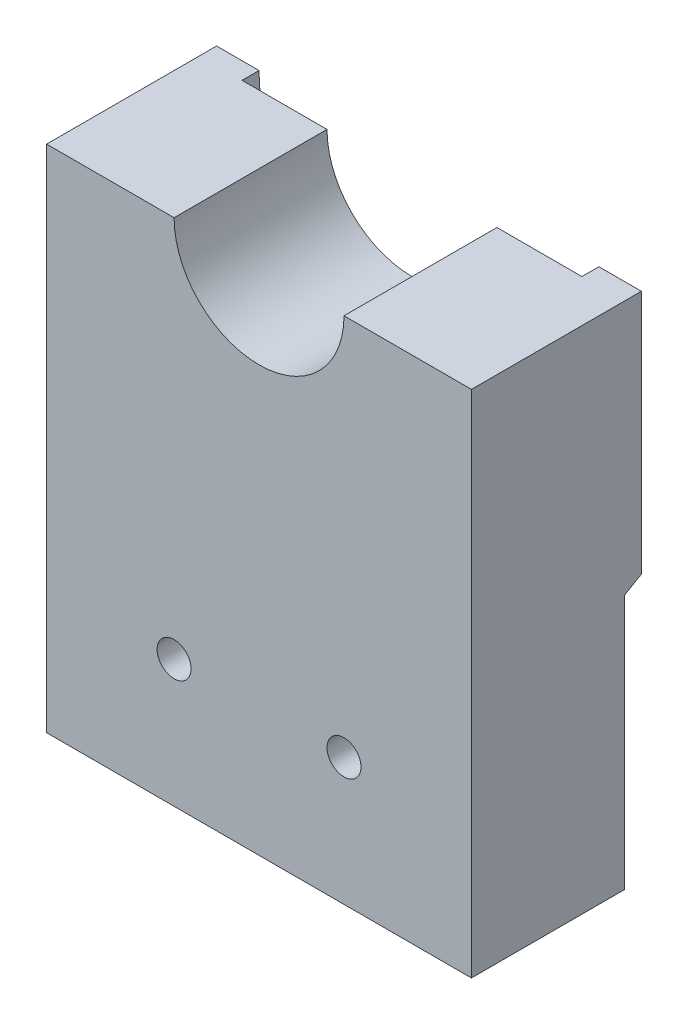
ISO-10303-21;
HEADER;
FILE_DESCRIPTION(('STEP AP214'),'2;1');
FILE_NAME('part.step','',(''),(''),'','','');
FILE_SCHEMA(('AUTOMOTIVE_DESIGN { 1 0 10303 214 1 1 1 1 }'));
ENDSEC;
DATA;
#1=APPLICATION_CONTEXT('core data for automotive mechanical design processes');
#2=APPLICATION_PROTOCOL_DEFINITION('international standard','automotive_design',2000,#1);
#3=PRODUCT_CONTEXT('',#1,'mechanical');
#4=PRODUCT('Part','Part','',(#3));
#5=PRODUCT_RELATED_PRODUCT_CATEGORY('part','',(#4));
#6=PRODUCT_DEFINITION_FORMATION('','',#4);
#7=PRODUCT_DEFINITION_CONTEXT('part definition',#1,'design');
#8=PRODUCT_DEFINITION('design','',#6,#7);
#9=PRODUCT_DEFINITION_SHAPE('','',#8);
#10=(LENGTH_UNIT() NAMED_UNIT(*) SI_UNIT(.MILLI.,.METRE.));
#11=(NAMED_UNIT(*) PLANE_ANGLE_UNIT() SI_UNIT($,.RADIAN.));
#12=(NAMED_UNIT(*) SI_UNIT($,.STERADIAN.) SOLID_ANGLE_UNIT());
#13=UNCERTAINTY_MEASURE_WITH_UNIT(LENGTH_MEASURE(1.E-05),#10,'distance_accuracy_value','');
#14=(GEOMETRIC_REPRESENTATION_CONTEXT(3) GLOBAL_UNCERTAINTY_ASSIGNED_CONTEXT((#13)) GLOBAL_UNIT_ASSIGNED_CONTEXT((#10,
#11,#12)) REPRESENTATION_CONTEXT('',''));
#15=CARTESIAN_POINT('',(0.,0.,0.));
#16=DIRECTION('',(0.,0.,1.));
#17=DIRECTION('',(1.,0.,0.));
#18=AXIS2_PLACEMENT_3D('',#15,#16,#17);
#19=CARTESIAN_POINT('',(0.,30.,10.));
#20=DIRECTION('',(0.,-1.,0.));
#21=DIRECTION('',(0.,0.,-1.));
#22=AXIS2_PLACEMENT_3D('',#19,#20,#21);
#23=PLANE('',#22);
#24=DIRECTION('',(-1.,0.,0.));
#25=VECTOR('',#24,1.);
#26=CARTESIAN_POINT('',(0.,30.,10.));
#27=LINE('',#26,#25);
#28=CARTESIAN_POINT('',(7.5,30.,10.));
#29=VERTEX_POINT('',#28);
#30=CARTESIAN_POINT('',(0.,30.,10.));
#31=VERTEX_POINT('',#30);
#32=EDGE_CURVE('E126',#29,#31,#27,.T.);
#33=ORIENTED_EDGE('',*,*,#32,.F.);
#34=DIRECTION('',(0.,0.,-1.));
#35=VECTOR('',#34,1.);
#36=CARTESIAN_POINT('',(7.5,30.,10.));
#37=LINE('',#36,#35);
#38=CARTESIAN_POINT('',(7.5,30.,1.00000000000001));
#39=VERTEX_POINT('',#38);
#40=EDGE_CURVE('E112',#29,#39,#37,.T.);
#41=ORIENTED_EDGE('',*,*,#40,.T.);
#42=DIRECTION('',(1.,0.,0.));
#43=VECTOR('',#42,1.);
#44=CARTESIAN_POINT('',(22.5,30.,1.00000000000001));
#45=LINE('',#44,#43);
#46=CARTESIAN_POINT('',(2.5,30.,1.00000000000001));
#47=VERTEX_POINT('',#46);
#48=EDGE_CURVE('E195',#47,#39,#45,.T.);
#49=ORIENTED_EDGE('',*,*,#48,.F.);
#50=DIRECTION('',(0.,0.,-1.));
#51=VECTOR('',#50,1.);
#52=CARTESIAN_POINT('',(2.5,30.,23.3606797749979));
#53=LINE('',#52,#51);
#54=CARTESIAN_POINT('',(2.5,30.,0.));
#55=VERTEX_POINT('',#54);
#56=EDGE_CURVE('E187',#47,#55,#53,.T.);
#57=ORIENTED_EDGE('',*,*,#56,.T.);
#58=DIRECTION('',(-1.,0.,0.));
#59=VECTOR('',#58,1.);
#60=CARTESIAN_POINT('',(0.,30.,0.));
#61=LINE('',#60,#59);
#62=CARTESIAN_POINT('',(0.,30.,0.));
#63=VERTEX_POINT('',#62);
#64=EDGE_CURVE('E146',#55,#63,#61,.T.);
#65=ORIENTED_EDGE('',*,*,#64,.T.);
#66=DIRECTION('',(0.,0.,-1.));
#67=VECTOR('',#66,1.);
#68=CARTESIAN_POINT('',(0.,30.,10.));
#69=LINE('',#68,#67);
#70=EDGE_CURVE('E132',#31,#63,#69,.T.);
#71=ORIENTED_EDGE('',*,*,#70,.F.);
#72=EDGE_LOOP('',(#33,#41,#49,#57,#65,#71));
#73=FACE_BOUND('',#72,.T.);
#74=ADVANCED_FACE('F36',(#73),#23,.F.);
#75=CARTESIAN_POINT('',(0.,0.,10.));
#76=DIRECTION('',(1.,0.,0.));
#77=DIRECTION('',(0.,0.,-1.));
#78=AXIS2_PLACEMENT_3D('',#75,#76,#77);
#79=PLANE('',#78);
#80=DIRECTION('',(0.,-0.499999999999998,0.86602540378444));
#81=VECTOR('',#80,1.);
#82=CARTESIAN_POINT('',(0.,15.5773502691896,0.));
#83=LINE('',#82,#81);
#84=CARTESIAN_POINT('',(0.,15.5773502691896,0.));
#85=VERTEX_POINT('',#84);
#86=CARTESIAN_POINT('',(0.,15.,1.));
#87=VERTEX_POINT('',#86);
#88=EDGE_CURVE('E181',#85,#87,#83,.T.);
#89=ORIENTED_EDGE('',*,*,#88,.T.);
#90=DIRECTION('',(0.,-1.,0.));
#91=VECTOR('',#90,1.);
#92=CARTESIAN_POINT('',(0.,15.,1.));
#93=LINE('',#92,#91);
#94=CARTESIAN_POINT('',(0.,0.,1.));
#95=VERTEX_POINT('',#94);
#96=EDGE_CURVE('E178',#87,#95,#93,.T.);
#97=ORIENTED_EDGE('',*,*,#96,.T.);
#98=DIRECTION('',(0.,0.,-1.));
#99=VECTOR('',#98,1.);
#100=CARTESIAN_POINT('',(0.,0.,10.));
#101=LINE('',#100,#99);
#102=CARTESIAN_POINT('',(0.,0.,10.));
#103=VERTEX_POINT('',#102);
#104=EDGE_CURVE('E11',#103,#95,#101,.T.);
#105=ORIENTED_EDGE('',*,*,#104,.F.);
#106=DIRECTION('',(0.,-1.,0.));
#107=VECTOR('',#106,1.);
#108=CARTESIAN_POINT('',(0.,0.,10.));
#109=LINE('',#108,#107);
#110=EDGE_CURVE('E150',#31,#103,#109,.T.);
#111=ORIENTED_EDGE('',*,*,#110,.F.);
#112=ORIENTED_EDGE('',*,*,#70,.T.);
#113=DIRECTION('',(0.,-1.,0.));
#114=VECTOR('',#113,1.);
#115=CARTESIAN_POINT('',(0.,0.,0.));
#116=LINE('',#115,#114);
#117=EDGE_CURVE('E140',#63,#85,#116,.T.);
#118=ORIENTED_EDGE('',*,*,#117,.T.);
#119=EDGE_LOOP('',(#89,#97,#105,#111,#112,#118));
#120=FACE_BOUND('',#119,.T.);
#121=ADVANCED_FACE('F38',(#120),#79,.F.);
#122=CARTESIAN_POINT('',(0.,0.,10.));
#123=DIRECTION('',(0.,1.,0.));
#124=DIRECTION('',(0.,0.,1.));
#125=AXIS2_PLACEMENT_3D('',#122,#123,#124);
#126=PLANE('',#125);
#127=ORIENTED_EDGE('',*,*,#104,.T.);
#128=DIRECTION('',(1.,0.,0.));
#129=VECTOR('',#128,1.);
#130=CARTESIAN_POINT('',(0.,0.,1.));
#131=LINE('',#130,#129);
#132=CARTESIAN_POINT('',(25.,0.,1.));
#133=VERTEX_POINT('',#132);
#134=EDGE_CURVE('E144',#95,#133,#131,.T.);
#135=ORIENTED_EDGE('',*,*,#134,.T.);
#136=DIRECTION('',(0.,0.,-1.));
#137=VECTOR('',#136,1.);
#138=CARTESIAN_POINT('',(25.,0.,10.));
#139=LINE('',#138,#137);
#140=CARTESIAN_POINT('',(25.,0.,10.));
#141=VERTEX_POINT('',#140);
#142=EDGE_CURVE('E44',#141,#133,#139,.T.);
#143=ORIENTED_EDGE('',*,*,#142,.F.);
#144=DIRECTION('',(1.,0.,0.));
#145=VECTOR('',#144,1.);
#146=CARTESIAN_POINT('',(0.,0.,10.));
#147=LINE('',#146,#145);
#148=EDGE_CURVE('E136',#103,#141,#147,.T.);
#149=ORIENTED_EDGE('',*,*,#148,.F.);
#150=EDGE_LOOP('',(#127,#135,#143,#149));
#151=FACE_BOUND('',#150,.T.);
#152=ADVANCED_FACE('F165',(#151),#126,.F.);
#153=CARTESIAN_POINT('',(25.,0.,10.));
#154=DIRECTION('',(-1.,0.,0.));
#155=DIRECTION('',(0.,0.,1.));
#156=AXIS2_PLACEMENT_3D('',#153,#154,#155);
#157=PLANE('',#156);
#158=ORIENTED_EDGE('',*,*,#142,.T.);
#159=DIRECTION('',(0.,-1.,0.));
#160=VECTOR('',#159,1.);
#161=CARTESIAN_POINT('',(25.,15.,1.));
#162=LINE('',#161,#160);
#163=CARTESIAN_POINT('',(25.,15.,1.));
#164=VERTEX_POINT('',#163);
#165=EDGE_CURVE('E161',#164,#133,#162,.T.);
#166=ORIENTED_EDGE('',*,*,#165,.F.);
#167=DIRECTION('',(0.,-0.499999999999998,0.86602540378444));
#168=VECTOR('',#167,1.);
#169=CARTESIAN_POINT('',(25.,15.5773502691896,0.));
#170=LINE('',#169,#168);
#171=CARTESIAN_POINT('',(25.,15.5773502691896,0.));
#172=VERTEX_POINT('',#171);
#173=EDGE_CURVE('E185',#172,#164,#170,.T.);
#174=ORIENTED_EDGE('',*,*,#173,.F.);
#175=DIRECTION('',(0.,1.,0.));
#176=VECTOR('',#175,1.);
#177=CARTESIAN_POINT('',(25.,0.,0.));
#178=LINE('',#177,#176);
#179=CARTESIAN_POINT('',(25.,30.,0.));
#180=VERTEX_POINT('',#179);
#181=EDGE_CURVE('E143',#172,#180,#178,.T.);
#182=ORIENTED_EDGE('',*,*,#181,.T.);
#183=DIRECTION('',(0.,0.,-1.));
#184=VECTOR('',#183,1.);
#185=CARTESIAN_POINT('',(25.,30.,10.));
#186=LINE('',#185,#184);
#187=CARTESIAN_POINT('',(25.,30.,10.));
#188=VERTEX_POINT('',#187);
#189=EDGE_CURVE('E152',#188,#180,#186,.T.);
#190=ORIENTED_EDGE('',*,*,#189,.F.);
#191=DIRECTION('',(0.,1.,0.));
#192=VECTOR('',#191,1.);
#193=CARTESIAN_POINT('',(25.,0.,10.));
#194=LINE('',#193,#192);
#195=EDGE_CURVE('E134',#141,#188,#194,.T.);
#196=ORIENTED_EDGE('',*,*,#195,.F.);
#197=EDGE_LOOP('',(#158,#166,#174,#182,#190,#196));
#198=FACE_BOUND('',#197,.T.);
#199=ADVANCED_FACE('F159',(#198),#157,.F.);
#200=CARTESIAN_POINT('',(17.5,30.,1.00000000000001));
#201=VERTEX_POINT('',#200);
#202=CARTESIAN_POINT('',(22.5,30.,1.00000000000001));
#203=VERTEX_POINT('',#202);
#204=EDGE_CURVE('E198',#201,#203,#45,.T.);
#205=ORIENTED_EDGE('',*,*,#204,.F.);
#206=DIRECTION('',(0.,0.,-1.));
#207=VECTOR('',#206,1.);
#208=CARTESIAN_POINT('',(17.5,30.,10.));
#209=LINE('',#208,#207);
#210=CARTESIAN_POINT('',(17.5,30.,10.));
#211=VERTEX_POINT('',#210);
#212=EDGE_CURVE('E51',#211,#201,#209,.T.);
#213=ORIENTED_EDGE('',*,*,#212,.F.);
#214=EDGE_CURVE('E129',#188,#211,#27,.T.);
#215=ORIENTED_EDGE('',*,*,#214,.F.);
#216=ORIENTED_EDGE('',*,*,#189,.T.);
#217=CARTESIAN_POINT('',(22.5,30.,0.));
#218=VERTEX_POINT('',#217);
#219=EDGE_CURVE('E147',#180,#218,#61,.T.);
#220=ORIENTED_EDGE('',*,*,#219,.T.);
#221=DIRECTION('',(0.,0.,-1.));
#222=VECTOR('',#221,1.);
#223=CARTESIAN_POINT('',(22.5,30.,23.3606797749979));
#224=LINE('',#223,#222);
#225=EDGE_CURVE('E59',#203,#218,#224,.T.);
#226=ORIENTED_EDGE('',*,*,#225,.F.);
#227=EDGE_LOOP('',(#205,#213,#215,#216,#220,#226));
#228=FACE_BOUND('',#227,.T.);
#229=ADVANCED_FACE('F239',(#228),#23,.F.);
#230=CARTESIAN_POINT('',(0.,0.,10.));
#231=DIRECTION('',(0.,0.,-1.));
#232=DIRECTION('',(-1.,0.,0.));
#233=AXIS2_PLACEMENT_3D('',#230,#231,#232);
#234=PLANE('',#233);
#235=CARTESIAN_POINT('',(17.5,7.5,10.));
#236=DIRECTION('',(0.,0.,-1.));
#237=DIRECTION('',(0.,1.,0.));
#238=AXIS2_PLACEMENT_3D('',#235,#236,#237);
#239=CIRCLE('',#238,1.);
#240=CARTESIAN_POINT('',(17.5,8.5,10.));
#241=VERTEX_POINT('',#240);
#242=EDGE_CURVE('E202',#241,#241,#239,.T.);
#243=ORIENTED_EDGE('',*,*,#242,.T.);
#244=EDGE_LOOP('',(#243));
#245=FACE_BOUND('',#244,.T.);
#246=CARTESIAN_POINT('',(7.5,7.5,10.));
#247=DIRECTION('',(0.,0.,-1.));
#248=DIRECTION('',(0.,-1.,0.));
#249=AXIS2_PLACEMENT_3D('',#246,#247,#248);
#250=CIRCLE('',#249,1.);
#251=CARTESIAN_POINT('',(7.5,6.5,10.));
#252=VERTEX_POINT('',#251);
#253=EDGE_CURVE('E207',#252,#252,#250,.T.);
#254=ORIENTED_EDGE('',*,*,#253,.T.);
#255=EDGE_LOOP('',(#254));
#256=FACE_BOUND('',#255,.T.);
#257=ORIENTED_EDGE('',*,*,#214,.T.);
#258=CARTESIAN_POINT('',(12.5,30.,10.));
#259=DIRECTION('',(0.,0.,-1.));
#260=DIRECTION('',(0.,1.,0.));
#261=AXIS2_PLACEMENT_3D('',#258,#259,#260);
#262=CIRCLE('',#261,5.);
#263=EDGE_CURVE('E115',#211,#29,#262,.T.);
#264=ORIENTED_EDGE('',*,*,#263,.T.);
#265=ORIENTED_EDGE('',*,*,#32,.T.);
#266=ORIENTED_EDGE('',*,*,#110,.T.);
#267=ORIENTED_EDGE('',*,*,#148,.T.);
#268=ORIENTED_EDGE('',*,*,#195,.T.);
#269=EDGE_LOOP('',(#257,#264,#265,#266,#267,#268));
#270=FACE_BOUND('',#269,.T.);
#271=ADVANCED_FACE('F124',(#245,#256,#270),#234,.F.);
#272=CARTESIAN_POINT('',(0.,0.,0.));
#273=DIRECTION('',(0.,0.,-1.));
#274=DIRECTION('',(-1.,0.,0.));
#275=AXIS2_PLACEMENT_3D('',#272,#273,#274);
#276=PLANE('',#275);
#277=CARTESIAN_POINT('',(12.5,30.,0.));
#278=DIRECTION('',(0.,0.,-1.));
#279=DIRECTION('',(-1.,0.,0.));
#280=AXIS2_PLACEMENT_3D('',#277,#278,#279);
#281=CIRCLE('',#280,10.);
#282=EDGE_CURVE('E199',#218,#55,#281,.T.);
#283=ORIENTED_EDGE('',*,*,#282,.F.);
#284=ORIENTED_EDGE('',*,*,#219,.F.);
#285=ORIENTED_EDGE('',*,*,#181,.F.);
#286=DIRECTION('',(1.,0.,0.));
#287=VECTOR('',#286,1.);
#288=CARTESIAN_POINT('',(0.,15.5773502691896,0.));
#289=LINE('',#288,#287);
#290=EDGE_CURVE('E172',#85,#172,#289,.T.);
#291=ORIENTED_EDGE('',*,*,#290,.F.);
#292=ORIENTED_EDGE('',*,*,#117,.F.);
#293=ORIENTED_EDGE('',*,*,#64,.F.);
#294=EDGE_LOOP('',(#283,#284,#285,#291,#292,#293));
#295=FACE_BOUND('',#294,.T.);
#296=ADVANCED_FACE('F229',(#295),#276,.T.);
#297=CARTESIAN_POINT('',(0.,15.,1.));
#298=DIRECTION('',(0.,0.,1.));
#299=DIRECTION('',(0.,-1.,0.));
#300=AXIS2_PLACEMENT_3D('',#297,#298,#299);
#301=PLANE('',#300);
#302=CARTESIAN_POINT('',(17.5,7.5,1.));
#303=DIRECTION('',(0.,0.,-1.));
#304=DIRECTION('',(0.,1.,0.));
#305=AXIS2_PLACEMENT_3D('',#302,#303,#304);
#306=CIRCLE('',#305,1.);
#307=CARTESIAN_POINT('',(17.5,8.5,1.));
#308=VERTEX_POINT('',#307);
#309=EDGE_CURVE('E210',#308,#308,#306,.T.);
#310=ORIENTED_EDGE('',*,*,#309,.F.);
#311=EDGE_LOOP('',(#310));
#312=FACE_BOUND('',#311,.T.);
#313=CARTESIAN_POINT('',(7.5,7.5,1.));
#314=DIRECTION('',(0.,0.,-1.));
#315=DIRECTION('',(0.,-1.,0.));
#316=AXIS2_PLACEMENT_3D('',#313,#314,#315);
#317=CIRCLE('',#316,1.);
#318=CARTESIAN_POINT('',(7.5,6.5,1.));
#319=VERTEX_POINT('',#318);
#320=EDGE_CURVE('E204',#319,#319,#317,.T.);
#321=ORIENTED_EDGE('',*,*,#320,.F.);
#322=EDGE_LOOP('',(#321));
#323=FACE_BOUND('',#322,.T.);
#324=ORIENTED_EDGE('',*,*,#165,.T.);
#325=ORIENTED_EDGE('',*,*,#134,.F.);
#326=ORIENTED_EDGE('',*,*,#96,.F.);
#327=DIRECTION('',(1.,0.,0.));
#328=VECTOR('',#327,1.);
#329=CARTESIAN_POINT('',(0.,15.,1.));
#330=LINE('',#329,#328);
#331=EDGE_CURVE('E170',#87,#164,#330,.T.);
#332=ORIENTED_EDGE('',*,*,#331,.T.);
#333=EDGE_LOOP('',(#324,#325,#326,#332));
#334=FACE_BOUND('',#333,.T.);
#335=ADVANCED_FACE('F225',(#312,#323,#334),#301,.F.);
#336=CARTESIAN_POINT('',(0.,15.5773502691896,0.));
#337=DIRECTION('',(0.,0.86602540378444,0.499999999999998));
#338=DIRECTION('',(0.,-0.499999999999998,0.86602540378444));
#339=AXIS2_PLACEMENT_3D('',#336,#337,#338);
#340=PLANE('',#339);
#341=ORIENTED_EDGE('',*,*,#173,.T.);
#342=ORIENTED_EDGE('',*,*,#331,.F.);
#343=ORIENTED_EDGE('',*,*,#88,.F.);
#344=ORIENTED_EDGE('',*,*,#290,.T.);
#345=EDGE_LOOP('',(#341,#342,#343,#344));
#346=FACE_BOUND('',#345,.T.);
#347=ADVANCED_FACE('F228',(#346),#340,.F.);
#348=CARTESIAN_POINT('',(0.,15.,1.));
#349=DIRECTION('',(0.,0.,1.));
#350=DIRECTION('',(0.,-1.,0.));
#351=AXIS2_PLACEMENT_3D('',#348,#349,#350);
#352=PLANE('',#351);
#353=ORIENTED_EDGE('',*,*,#48,.T.);
#354=CARTESIAN_POINT('',(12.5,30.,1.00000000000001));
#355=DIRECTION('',(0.,0.,-1.));
#356=DIRECTION('',(0.,1.,0.));
#357=AXIS2_PLACEMENT_3D('',#354,#355,#356);
#358=CIRCLE('',#357,5.);
#359=EDGE_CURVE('E116',#201,#39,#358,.T.);
#360=ORIENTED_EDGE('',*,*,#359,.F.);
#361=ORIENTED_EDGE('',*,*,#204,.T.);
#362=CARTESIAN_POINT('',(12.5,30.,1.00000000000001));
#363=DIRECTION('',(0.,0.,1.));
#364=DIRECTION('',(0.,-1.,0.));
#365=AXIS2_PLACEMENT_3D('',#362,#363,#364);
#366=CIRCLE('',#365,10.);
#367=EDGE_CURVE('E190',#203,#47,#366,.F.);
#368=ORIENTED_EDGE('',*,*,#367,.T.);
#369=EDGE_LOOP('',(#353,#360,#361,#368));
#370=FACE_BOUND('',#369,.T.);
#371=ADVANCED_FACE('F241',(#370),#352,.F.);
#372=CARTESIAN_POINT('',(12.5,30.,23.3606797749979));
#373=DIRECTION('',(0.,0.,-1.));
#374=DIRECTION('',(-1.,0.,0.));
#375=AXIS2_PLACEMENT_3D('',#372,#373,#374);
#376=CYLINDRICAL_SURFACE('',#375,10.);
#377=ORIENTED_EDGE('',*,*,#225,.T.);
#378=ORIENTED_EDGE('',*,*,#282,.T.);
#379=ORIENTED_EDGE('',*,*,#56,.F.);
#380=ORIENTED_EDGE('',*,*,#367,.F.);
#381=EDGE_LOOP('',(#377,#378,#379,#380));
#382=FACE_BOUND('',#381,.T.);
#383=ADVANCED_FACE('F242',(#382),#376,.F.);
#384=CARTESIAN_POINT('',(12.5,30.,10.));
#385=DIRECTION('',(0.,0.,-1.));
#386=DIRECTION('',(0.,1.,0.));
#387=AXIS2_PLACEMENT_3D('',#384,#385,#386);
#388=CYLINDRICAL_SURFACE('',#387,5.);
#389=ORIENTED_EDGE('',*,*,#359,.T.);
#390=ORIENTED_EDGE('',*,*,#40,.F.);
#391=ORIENTED_EDGE('',*,*,#263,.F.);
#392=ORIENTED_EDGE('',*,*,#212,.T.);
#393=EDGE_LOOP('',(#389,#390,#391,#392));
#394=FACE_BOUND('',#393,.T.);
#395=ADVANCED_FACE('F114',(#394),#388,.F.);
#396=CARTESIAN_POINT('',(7.5,7.5,10.));
#397=DIRECTION('',(0.,0.,-1.));
#398=DIRECTION('',(0.,1.,0.));
#399=AXIS2_PLACEMENT_3D('',#396,#397,#398);
#400=CYLINDRICAL_SURFACE('',#399,1.);
#401=ORIENTED_EDGE('',*,*,#253,.F.);
#402=EDGE_LOOP('',(#401));
#403=FACE_BOUND('',#402,.T.);
#404=ORIENTED_EDGE('',*,*,#320,.T.);
#405=EDGE_LOOP('',(#404));
#406=FACE_BOUND('',#405,.T.);
#407=ADVANCED_FACE('F221',(#403,#406),#400,.F.);
#408=CARTESIAN_POINT('',(17.5,7.5,10.));
#409=DIRECTION('',(0.,0.,-1.));
#410=DIRECTION('',(0.,1.,0.));
#411=AXIS2_PLACEMENT_3D('',#408,#409,#410);
#412=CYLINDRICAL_SURFACE('',#411,1.);
#413=ORIENTED_EDGE('',*,*,#242,.F.);
#414=EDGE_LOOP('',(#413));
#415=FACE_BOUND('',#414,.T.);
#416=ORIENTED_EDGE('',*,*,#309,.T.);
#417=EDGE_LOOP('',(#416));
#418=FACE_BOUND('',#417,.T.);
#419=ADVANCED_FACE('F218',(#415,#418),#412,.F.);
#420=CLOSED_SHELL('',(#74,#121,#152,#199,#229,#271,#296,#335,#347,#371,#383,#395,#407,#419));
#421=MANIFOLD_SOLID_BREP('B2',#420);
#422=ADVANCED_BREP_SHAPE_REPRESENTATION('',(#18,#421),#14);
#423=SHAPE_DEFINITION_REPRESENTATION(#9,#422);
ENDSEC;
END-ISO-10303-21;
